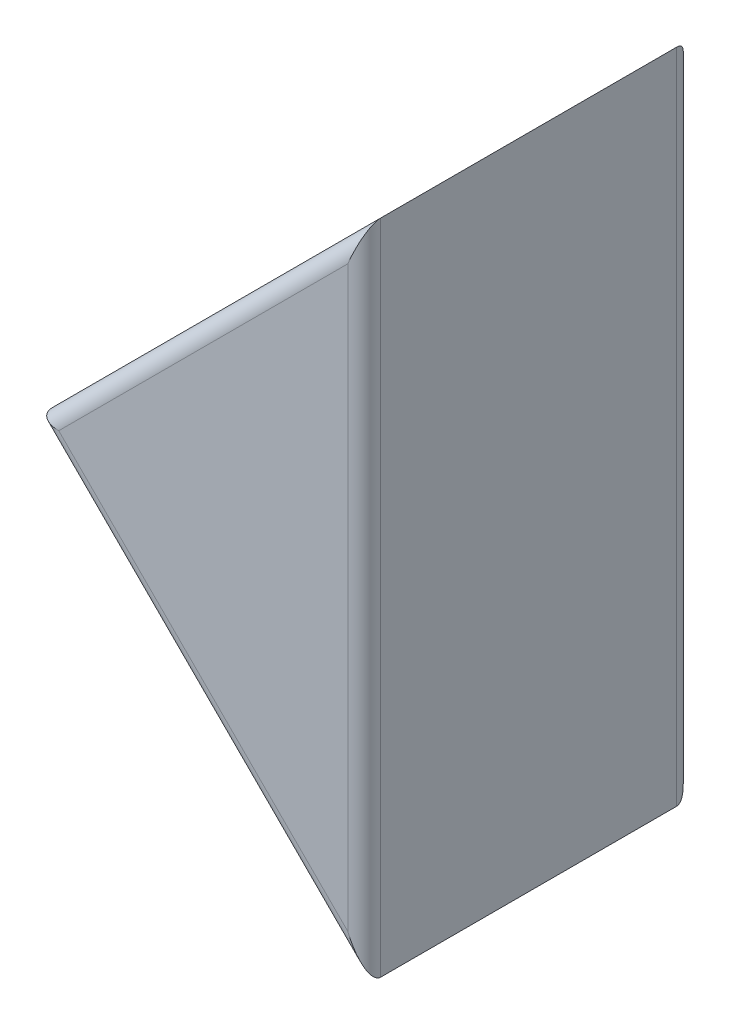
ISO-10303-21;
HEADER;
FILE_DESCRIPTION(('STEP AP214'),'2;1');
FILE_NAME('part.step','',(''),(''),'','','');
FILE_SCHEMA(('AUTOMOTIVE_DESIGN { 1 0 10303 214 1 1 1 1 }'));
ENDSEC;
DATA;
#1=APPLICATION_CONTEXT('core data for automotive mechanical design processes');
#2=APPLICATION_PROTOCOL_DEFINITION('international standard','automotive_design',2000,#1);
#3=PRODUCT_CONTEXT('',#1,'mechanical');
#4=PRODUCT('Part','Part','',(#3));
#5=PRODUCT_RELATED_PRODUCT_CATEGORY('part','',(#4));
#6=PRODUCT_DEFINITION_FORMATION('','',#4);
#7=PRODUCT_DEFINITION_CONTEXT('part definition',#1,'design');
#8=PRODUCT_DEFINITION('design','',#6,#7);
#9=PRODUCT_DEFINITION_SHAPE('','',#8);
#10=(LENGTH_UNIT() NAMED_UNIT(*) SI_UNIT(.MILLI.,.METRE.));
#11=(NAMED_UNIT(*) PLANE_ANGLE_UNIT() SI_UNIT($,.RADIAN.));
#12=(NAMED_UNIT(*) SI_UNIT($,.STERADIAN.) SOLID_ANGLE_UNIT());
#13=UNCERTAINTY_MEASURE_WITH_UNIT(LENGTH_MEASURE(1.E-05),#10,'distance_accuracy_value','');
#14=(GEOMETRIC_REPRESENTATION_CONTEXT(3) GLOBAL_UNCERTAINTY_ASSIGNED_CONTEXT((#13)) GLOBAL_UNIT_ASSIGNED_CONTEXT((#10,
#11,#12)) REPRESENTATION_CONTEXT('',''));
#15=CARTESIAN_POINT('',(0.,0.,0.));
#16=DIRECTION('',(0.,0.,1.));
#17=DIRECTION('',(1.,0.,0.));
#18=AXIS2_PLACEMENT_3D('',#15,#16,#17);
#19=CARTESIAN_POINT('',(-10.,40.,-10.));
#20=DIRECTION('',(0.,0.,1.));
#21=DIRECTION('',(1.,0.,0.));
#22=AXIS2_PLACEMENT_3D('',#19,#20,#21);
#23=PLANE('',#22);
#24=DIRECTION('',(-0.707106781186548,-0.707106781186548,0.));
#25=VECTOR('',#24,1.);
#26=CARTESIAN_POINT('',(10.7071067811866,39.2928932188135,-10.));
#27=LINE('',#26,#25);
#28=CARTESIAN_POINT('',(-8.5857864376269,20.,-10.));
#29=VERTEX_POINT('',#28);
#30=CARTESIAN_POINT('',(9.,37.5857864376269,-10.));
#31=VERTEX_POINT('',#30);
#32=EDGE_CURVE('E43',#29,#31,#27,.F.);
#33=ORIENTED_EDGE('',*,*,#32,.T.);
#34=DIRECTION('',(0.,-1.,0.));
#35=VECTOR('',#34,1.);
#36=CARTESIAN_POINT('',(9.,40.,-10.));
#37=LINE('',#36,#35);
#38=CARTESIAN_POINT('',(9.,2.4142135623731,-10.));
#39=VERTEX_POINT('',#38);
#40=EDGE_CURVE('E11',#31,#39,#37,.T.);
#41=ORIENTED_EDGE('',*,*,#40,.T.);
#42=DIRECTION('',(0.707106781186548,-0.707106781186548,0.));
#43=VECTOR('',#42,1.);
#44=CARTESIAN_POINT('',(-9.29289321881345,20.7071067811865,-10.));
#45=LINE('',#44,#43);
#46=EDGE_CURVE('E53',#39,#29,#45,.F.);
#47=ORIENTED_EDGE('',*,*,#46,.T.);
#48=EDGE_LOOP('',(#33,#41,#47));
#49=FACE_BOUND('',#48,.T.);
#50=ADVANCED_FACE('F34',(#49),#23,.F.);
#51=CARTESIAN_POINT('',(-10.,40.,10.));
#52=DIRECTION('',(0.,0.,-1.));
#53=DIRECTION('',(-1.,0.,0.));
#54=AXIS2_PLACEMENT_3D('',#51,#52,#53);
#55=PLANE('',#54);
#56=DIRECTION('',(0.,-1.,0.));
#57=VECTOR('',#56,1.);
#58=CARTESIAN_POINT('',(9.,40.,10.));
#59=LINE('',#58,#57);
#60=CARTESIAN_POINT('',(9.,2.4142135623731,10.));
#61=VERTEX_POINT('',#60);
#62=CARTESIAN_POINT('',(9.,37.5857864376269,10.));
#63=VERTEX_POINT('',#62);
#64=EDGE_CURVE('E105',#61,#63,#59,.F.);
#65=ORIENTED_EDGE('',*,*,#64,.T.);
#66=DIRECTION('',(-0.707106781186548,-0.707106781186548,0.));
#67=VECTOR('',#66,1.);
#68=CARTESIAN_POINT('',(-9.29289321881346,19.2928932188135,10.));
#69=LINE('',#68,#67);
#70=CARTESIAN_POINT('',(-8.5857864376269,20.,10.));
#71=VERTEX_POINT('',#70);
#72=EDGE_CURVE('E91',#63,#71,#69,.T.);
#73=ORIENTED_EDGE('',*,*,#72,.T.);
#74=DIRECTION('',(0.707106781186548,-0.707106781186548,0.));
#75=VECTOR('',#74,1.);
#76=CARTESIAN_POINT('',(10.7071067811865,0.707106781186548,10.));
#77=LINE('',#76,#75);
#78=EDGE_CURVE('E99',#71,#61,#77,.T.);
#79=ORIENTED_EDGE('',*,*,#78,.T.);
#80=EDGE_LOOP('',(#65,#73,#79));
#81=FACE_BOUND('',#80,.T.);
#82=ADVANCED_FACE('F108',(#81),#55,.F.);
#83=CARTESIAN_POINT('',(10.,40.,10.));
#84=DIRECTION('',(-1.,0.,0.));
#85=DIRECTION('',(0.,0.,1.));
#86=AXIS2_PLACEMENT_3D('',#83,#84,#85);
#87=PLANE('',#86);
#88=DIRECTION('',(0.,0.,-1.));
#89=VECTOR('',#88,1.);
#90=CARTESIAN_POINT('',(10.,40.,10.));
#91=LINE('',#90,#89);
#92=CARTESIAN_POINT('',(10.,40.,9.));
#93=VERTEX_POINT('',#92);
#94=CARTESIAN_POINT('',(10.,40.,-9.));
#95=VERTEX_POINT('',#94);
#96=EDGE_CURVE('E106',#93,#95,#91,.T.);
#97=ORIENTED_EDGE('',*,*,#96,.F.);
#98=DIRECTION('',(0.,-1.,0.));
#99=VECTOR('',#98,1.);
#100=CARTESIAN_POINT('',(10.,40.,9.));
#101=LINE('',#100,#99);
#102=CARTESIAN_POINT('',(10.,0.,9.));
#103=VERTEX_POINT('',#102);
#104=EDGE_CURVE('E119',#93,#103,#101,.T.);
#105=ORIENTED_EDGE('',*,*,#104,.T.);
#106=DIRECTION('',(0.,0.,-1.));
#107=VECTOR('',#106,1.);
#108=CARTESIAN_POINT('',(10.,0.,10.));
#109=LINE('',#108,#107);
#110=CARTESIAN_POINT('',(10.,0.,-9.));
#111=VERTEX_POINT('',#110);
#112=EDGE_CURVE('E242',#103,#111,#109,.T.);
#113=ORIENTED_EDGE('',*,*,#112,.T.);
#114=DIRECTION('',(0.,-1.,0.));
#115=VECTOR('',#114,1.);
#116=CARTESIAN_POINT('',(10.,40.,-9.));
#117=LINE('',#116,#115);
#118=EDGE_CURVE('E116',#111,#95,#117,.F.);
#119=ORIENTED_EDGE('',*,*,#118,.T.);
#120=EDGE_LOOP('',(#97,#105,#113,#119));
#121=FACE_BOUND('',#120,.T.);
#122=ADVANCED_FACE('F149',(#121),#87,.F.);
#123=CARTESIAN_POINT('',(-15.,15.,-10.));
#124=DIRECTION('',(-0.707106781186548,0.707106781186548,0.));
#125=DIRECTION('',(-0.707106781186548,-0.707106781186548,0.));
#126=AXIS2_PLACEMENT_3D('',#123,#124,#125);
#127=PLANE('',#126);
#128=DIRECTION('',(0.,0.,1.));
#129=VECTOR('',#128,1.);
#130=CARTESIAN_POINT('',(-10.,20.,-10.));
#131=LINE('',#130,#129);
#132=CARTESIAN_POINT('',(-10.,20.,-9.));
#133=VERTEX_POINT('',#132);
#134=CARTESIAN_POINT('',(-10.,20.,9.));
#135=VERTEX_POINT('',#134);
#136=EDGE_CURVE('E129',#133,#135,#131,.T.);
#137=ORIENTED_EDGE('',*,*,#136,.T.);
#138=DIRECTION('',(-0.707106781186548,-0.707106781186548,0.));
#139=VECTOR('',#138,1.);
#140=CARTESIAN_POINT('',(10.,40.,9.));
#141=LINE('',#140,#139);
#142=EDGE_CURVE('E93',#135,#93,#141,.F.);
#143=ORIENTED_EDGE('',*,*,#142,.T.);
#144=ORIENTED_EDGE('',*,*,#96,.T.);
#145=DIRECTION('',(-0.707106781186548,-0.707106781186548,0.));
#146=VECTOR('',#145,1.);
#147=CARTESIAN_POINT('',(-10.,20.,-9.));
#148=LINE('',#147,#146);
#149=EDGE_CURVE('E110',#95,#133,#148,.T.);
#150=ORIENTED_EDGE('',*,*,#149,.T.);
#151=EDGE_LOOP('',(#137,#143,#144,#150));
#152=FACE_BOUND('',#151,.T.);
#153=ADVANCED_FACE('F155',(#152),#127,.T.);
#154=CARTESIAN_POINT('',(5.,5.,-10.));
#155=DIRECTION('',(-0.707106781186548,-0.707106781186548,0.));
#156=DIRECTION('',(0.707106781186548,-0.707106781186548,0.));
#157=AXIS2_PLACEMENT_3D('',#154,#155,#156);
#158=PLANE('',#157);
#159=ORIENTED_EDGE('',*,*,#112,.F.);
#160=DIRECTION('',(0.707106781186548,-0.707106781186548,0.));
#161=VECTOR('',#160,1.);
#162=CARTESIAN_POINT('',(-10.,20.,9.));
#163=LINE('',#162,#161);
#164=EDGE_CURVE('E123',#103,#135,#163,.F.);
#165=ORIENTED_EDGE('',*,*,#164,.T.);
#166=ORIENTED_EDGE('',*,*,#136,.F.);
#167=DIRECTION('',(0.707106781186548,-0.707106781186548,0.));
#168=VECTOR('',#167,1.);
#169=CARTESIAN_POINT('',(10.,0.,-9.));
#170=LINE('',#169,#168);
#171=EDGE_CURVE('E121',#133,#111,#170,.T.);
#172=ORIENTED_EDGE('',*,*,#171,.T.);
#173=EDGE_LOOP('',(#159,#165,#166,#172));
#174=FACE_BOUND('',#173,.T.);
#175=ADVANCED_FACE('F164',(#174),#158,.T.);
#176=CARTESIAN_POINT('',(9.,40.,9.));
#177=DIRECTION('',(0.,-1.,0.));
#178=DIRECTION('',(0.,0.,-1.));
#179=AXIS2_PLACEMENT_3D('',#176,#177,#178);
#180=CYLINDRICAL_SURFACE('',#179,1.);
#181=CARTESIAN_POINT('',(9.,37.5857864376269,9.));
#182=DIRECTION('',(0.923879532511287,-0.38268343236509,0.));
#183=DIRECTION('',(-0.38268343236509,-0.923879532511287,0.));
#184=AXIS2_PLACEMENT_3D('',#181,#182,#183);
#185=ELLIPSE('',#184,2.61312592975275,1.);
#186=EDGE_CURVE('E96',#63,#93,#185,.F.);
#187=ORIENTED_EDGE('',*,*,#186,.F.);
#188=ORIENTED_EDGE('',*,*,#64,.F.);
#189=CARTESIAN_POINT('',(9.,2.4142135623731,9.));
#190=DIRECTION('',(-0.923879532511287,-0.38268343236509,0.));
#191=DIRECTION('',(-0.38268343236509,0.923879532511287,0.));
#192=AXIS2_PLACEMENT_3D('',#189,#190,#191);
#193=ELLIPSE('',#192,2.61312592975275,1.);
#194=EDGE_CURVE('E102',#103,#61,#193,.T.);
#195=ORIENTED_EDGE('',*,*,#194,.F.);
#196=ORIENTED_EDGE('',*,*,#104,.F.);
#197=EDGE_LOOP('',(#187,#188,#195,#196));
#198=FACE_BOUND('',#197,.T.);
#199=ADVANCED_FACE('F161',(#198),#180,.T.);
#200=CARTESIAN_POINT('',(-19.2928932188135,30.7071067811865,9.));
#201=DIRECTION('',(-0.707106781186548,0.707106781186548,0.));
#202=DIRECTION('',(-0.707106781186548,-0.707106781186548,0.));
#203=AXIS2_PLACEMENT_3D('',#200,#201,#202);
#204=CYLINDRICAL_SURFACE('',#203,1.);
#205=ORIENTED_EDGE('',*,*,#194,.T.);
#206=ORIENTED_EDGE('',*,*,#78,.F.);
#207=CARTESIAN_POINT('',(-8.5857864376269,20.,9.));
#208=DIRECTION('',(0.,1.,0.));
#209=DIRECTION('',(-1.,0.,0.));
#210=AXIS2_PLACEMENT_3D('',#207,#208,#209);
#211=ELLIPSE('',#210,1.41421356237309,1.);
#212=EDGE_CURVE('E87',#135,#71,#211,.T.);
#213=ORIENTED_EDGE('',*,*,#212,.F.);
#214=ORIENTED_EDGE('',*,*,#164,.F.);
#215=EDGE_LOOP('',(#205,#206,#213,#214));
#216=FACE_BOUND('',#215,.T.);
#217=ADVANCED_FACE('F100',(#216),#204,.T.);
#218=CARTESIAN_POINT('',(0.707106781186548,29.2928932188135,9.));
#219=DIRECTION('',(0.707106781186548,0.707106781186548,0.));
#220=DIRECTION('',(-0.707106781186548,0.707106781186548,0.));
#221=AXIS2_PLACEMENT_3D('',#218,#219,#220);
#222=CYLINDRICAL_SURFACE('',#221,1.);
#223=ORIENTED_EDGE('',*,*,#186,.T.);
#224=ORIENTED_EDGE('',*,*,#142,.F.);
#225=ORIENTED_EDGE('',*,*,#212,.T.);
#226=ORIENTED_EDGE('',*,*,#72,.F.);
#227=EDGE_LOOP('',(#223,#224,#225,#226));
#228=FACE_BOUND('',#227,.T.);
#229=ADVANCED_FACE('F89',(#228),#222,.T.);
#230=CARTESIAN_POINT('',(-14.2928932188135,14.2928932188135,-9.));
#231=DIRECTION('',(0.707106781186548,0.707106781186548,0.));
#232=DIRECTION('',(-0.707106781186548,0.707106781186548,0.));
#233=AXIS2_PLACEMENT_3D('',#230,#231,#232);
#234=CYLINDRICAL_SURFACE('',#233,1.);
#235=CARTESIAN_POINT('',(9.,37.5857864376269,-9.));
#236=DIRECTION('',(0.923879532511287,-0.38268343236509,0.));
#237=DIRECTION('',(0.38268343236509,0.923879532511287,0.));
#238=AXIS2_PLACEMENT_3D('',#235,#236,#237);
#239=ELLIPSE('',#238,2.61312592975275,1.);
#240=EDGE_CURVE('E131',#31,#95,#239,.T.);
#241=ORIENTED_EDGE('',*,*,#240,.F.);
#242=ORIENTED_EDGE('',*,*,#32,.F.);
#243=CARTESIAN_POINT('',(-8.5857864376269,20.,-9.));
#244=DIRECTION('',(0.,1.,0.));
#245=DIRECTION('',(-1.,0.,0.));
#246=AXIS2_PLACEMENT_3D('',#243,#244,#245);
#247=ELLIPSE('',#246,1.41421356237309,1.);
#248=EDGE_CURVE('E38',#133,#29,#247,.F.);
#249=ORIENTED_EDGE('',*,*,#248,.F.);
#250=ORIENTED_EDGE('',*,*,#149,.F.);
#251=EDGE_LOOP('',(#241,#242,#249,#250));
#252=FACE_BOUND('',#251,.T.);
#253=ADVANCED_FACE('F36',(#252),#234,.T.);
#254=CARTESIAN_POINT('',(5.70710678118655,5.70710678118655,-9.));
#255=DIRECTION('',(-0.707106781186548,0.707106781186548,0.));
#256=DIRECTION('',(-0.707106781186548,-0.707106781186548,0.));
#257=AXIS2_PLACEMENT_3D('',#254,#255,#256);
#258=CYLINDRICAL_SURFACE('',#257,1.);
#259=ORIENTED_EDGE('',*,*,#248,.T.);
#260=ORIENTED_EDGE('',*,*,#46,.F.);
#261=CARTESIAN_POINT('',(9.,2.4142135623731,-9.));
#262=DIRECTION('',(-0.923879532511287,-0.38268343236509,0.));
#263=DIRECTION('',(-0.38268343236509,0.923879532511287,0.));
#264=AXIS2_PLACEMENT_3D('',#261,#262,#263);
#265=ELLIPSE('',#264,2.61312592975275,1.);
#266=EDGE_CURVE('E130',#111,#39,#265,.F.);
#267=ORIENTED_EDGE('',*,*,#266,.F.);
#268=ORIENTED_EDGE('',*,*,#171,.F.);
#269=EDGE_LOOP('',(#259,#260,#267,#268));
#270=FACE_BOUND('',#269,.T.);
#271=ADVANCED_FACE('F140',(#270),#258,.T.);
#272=CARTESIAN_POINT('',(9.,40.,-9.));
#273=DIRECTION('',(0.,-1.,0.));
#274=DIRECTION('',(0.,0.,-1.));
#275=AXIS2_PLACEMENT_3D('',#272,#273,#274);
#276=CYLINDRICAL_SURFACE('',#275,1.);
#277=ORIENTED_EDGE('',*,*,#240,.T.);
#278=ORIENTED_EDGE('',*,*,#118,.F.);
#279=ORIENTED_EDGE('',*,*,#266,.T.);
#280=ORIENTED_EDGE('',*,*,#40,.F.);
#281=EDGE_LOOP('',(#277,#278,#279,#280));
#282=FACE_BOUND('',#281,.T.);
#283=ADVANCED_FACE('F143',(#282),#276,.T.);
#284=CLOSED_SHELL('',(#50,#82,#122,#153,#175,#199,#217,#229,#253,#271,#283));
#285=MANIFOLD_SOLID_BREP('B2',#284);
#286=ADVANCED_BREP_SHAPE_REPRESENTATION('',(#18,#285),#14);
#287=SHAPE_DEFINITION_REPRESENTATION(#9,#286);
ENDSEC;
END-ISO-10303-21;
